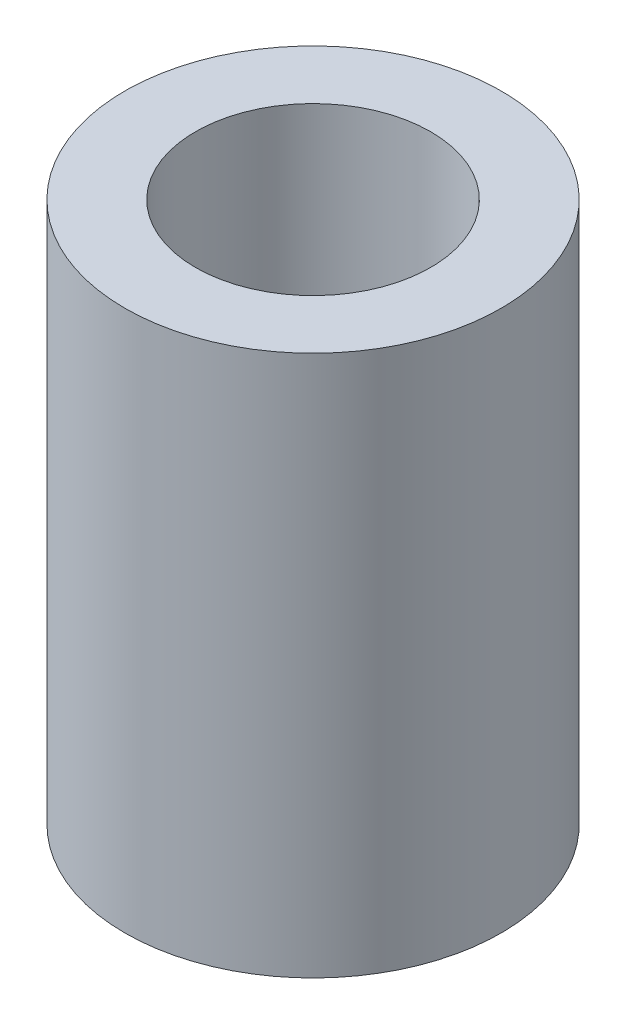
ISO-10303-21;
HEADER;
FILE_DESCRIPTION(('STEP AP214'),'2;1');
FILE_NAME('part.step','',(''),(''),'','','');
FILE_SCHEMA(('AUTOMOTIVE_DESIGN { 1 0 10303 214 1 1 1 1 }'));
ENDSEC;
DATA;
#1=APPLICATION_CONTEXT('core data for automotive mechanical design processes');
#2=APPLICATION_PROTOCOL_DEFINITION('international standard','automotive_design',2000,#1);
#3=PRODUCT_CONTEXT('',#1,'mechanical');
#4=PRODUCT('Part','Part','',(#3));
#5=PRODUCT_RELATED_PRODUCT_CATEGORY('part','',(#4));
#6=PRODUCT_DEFINITION_FORMATION('','',#4);
#7=PRODUCT_DEFINITION_CONTEXT('part definition',#1,'design');
#8=PRODUCT_DEFINITION('design','',#6,#7);
#9=PRODUCT_DEFINITION_SHAPE('','',#8);
#10=(LENGTH_UNIT() NAMED_UNIT(*) SI_UNIT(.MILLI.,.METRE.));
#11=(NAMED_UNIT(*) PLANE_ANGLE_UNIT() SI_UNIT($,.RADIAN.));
#12=(NAMED_UNIT(*) SI_UNIT($,.STERADIAN.) SOLID_ANGLE_UNIT());
#13=UNCERTAINTY_MEASURE_WITH_UNIT(LENGTH_MEASURE(1.E-05),#10,'distance_accuracy_value','');
#14=(GEOMETRIC_REPRESENTATION_CONTEXT(3) GLOBAL_UNCERTAINTY_ASSIGNED_CONTEXT((#13)) GLOBAL_UNIT_ASSIGNED_CONTEXT((#10,
#11,#12)) REPRESENTATION_CONTEXT('',''));
#15=CARTESIAN_POINT('',(0.,0.,0.));
#16=DIRECTION('',(0.,0.,1.));
#17=DIRECTION('',(1.,0.,0.));
#18=AXIS2_PLACEMENT_3D('',#15,#16,#17);
#19=CARTESIAN_POINT('',(0.,23.,0.));
#20=DIRECTION('',(0.,1.,0.));
#21=DIRECTION('',(0.,0.,1.));
#22=AXIS2_PLACEMENT_3D('',#19,#20,#21);
#23=PLANE('',#22);
#24=CARTESIAN_POINT('',(0.,23.,0.));
#25=DIRECTION('',(0.,1.,0.));
#26=DIRECTION('',(0.,0.,1.));
#27=AXIS2_PLACEMENT_3D('',#24,#25,#26);
#28=CIRCLE('',#27,8.);
#29=CARTESIAN_POINT('',(0.,23.,8.));
#30=VERTEX_POINT('',#29);
#31=EDGE_CURVE('E10',#30,#30,#28,.T.);
#32=ORIENTED_EDGE('',*,*,#31,.T.);
#33=EDGE_LOOP('',(#32));
#34=FACE_BOUND('',#33,.T.);
#35=CARTESIAN_POINT('',(0.,23.,0.));
#36=DIRECTION('',(0.,1.,0.));
#37=DIRECTION('',(0.,0.,1.));
#38=AXIS2_PLACEMENT_3D('',#35,#36,#37);
#39=CIRCLE('',#38,5.);
#40=CARTESIAN_POINT('',(0.,23.,5.));
#41=VERTEX_POINT('',#40);
#42=EDGE_CURVE('E42',#41,#41,#39,.T.);
#43=ORIENTED_EDGE('',*,*,#42,.F.);
#44=EDGE_LOOP('',(#43));
#45=FACE_BOUND('',#44,.T.);
#46=ADVANCED_FACE('F31',(#34,#45),#23,.T.);
#47=CARTESIAN_POINT('',(0.,0.,0.));
#48=DIRECTION('',(0.,1.,0.));
#49=DIRECTION('',(0.,0.,1.));
#50=AXIS2_PLACEMENT_3D('',#47,#48,#49);
#51=PLANE('',#50);
#52=CARTESIAN_POINT('',(0.,0.,0.));
#53=DIRECTION('',(0.,1.,0.));
#54=DIRECTION('',(0.,0.,1.));
#55=AXIS2_PLACEMENT_3D('',#52,#53,#54);
#56=CIRCLE('',#55,8.);
#57=CARTESIAN_POINT('',(0.,0.,8.));
#58=VERTEX_POINT('',#57);
#59=EDGE_CURVE('E35',#58,#58,#56,.T.);
#60=ORIENTED_EDGE('',*,*,#59,.F.);
#61=EDGE_LOOP('',(#60));
#62=FACE_BOUND('',#61,.T.);
#63=CARTESIAN_POINT('',(0.,0.,0.));
#64=DIRECTION('',(0.,1.,0.));
#65=DIRECTION('',(0.,0.,1.));
#66=AXIS2_PLACEMENT_3D('',#63,#64,#65);
#67=CIRCLE('',#66,5.);
#68=CARTESIAN_POINT('',(0.,0.,5.));
#69=VERTEX_POINT('',#68);
#70=EDGE_CURVE('E44',#69,#69,#67,.T.);
#71=ORIENTED_EDGE('',*,*,#70,.T.);
#72=EDGE_LOOP('',(#71));
#73=FACE_BOUND('',#72,.T.);
#74=ADVANCED_FACE('F54',(#62,#73),#51,.F.);
#75=CARTESIAN_POINT('',(0.,23.,0.));
#76=DIRECTION('',(0.,-1.,0.));
#77=DIRECTION('',(0.,0.,-1.));
#78=AXIS2_PLACEMENT_3D('',#75,#76,#77);
#79=CYLINDRICAL_SURFACE('',#78,8.);
#80=ORIENTED_EDGE('',*,*,#31,.F.);
#81=EDGE_LOOP('',(#80));
#82=FACE_BOUND('',#81,.T.);
#83=ORIENTED_EDGE('',*,*,#59,.T.);
#84=EDGE_LOOP('',(#83));
#85=FACE_BOUND('',#84,.T.);
#86=ADVANCED_FACE('F33',(#82,#85),#79,.T.);
#87=CARTESIAN_POINT('',(0.,23.,0.));
#88=DIRECTION('',(0.,-1.,0.));
#89=DIRECTION('',(0.,0.,-1.));
#90=AXIS2_PLACEMENT_3D('',#87,#88,#89);
#91=CYLINDRICAL_SURFACE('',#90,5.);
#92=ORIENTED_EDGE('',*,*,#42,.T.);
#93=EDGE_LOOP('',(#92));
#94=FACE_BOUND('',#93,.T.);
#95=ORIENTED_EDGE('',*,*,#70,.F.);
#96=EDGE_LOOP('',(#95));
#97=FACE_BOUND('',#96,.T.);
#98=ADVANCED_FACE('F50',(#94,#97),#91,.F.);
#99=CLOSED_SHELL('',(#46,#74,#86,#98));
#100=MANIFOLD_SOLID_BREP('B2',#99);
#101=ADVANCED_BREP_SHAPE_REPRESENTATION('',(#18,#100),#14);
#102=SHAPE_DEFINITION_REPRESENTATION(#9,#101);
ENDSEC;
END-ISO-10303-21;
